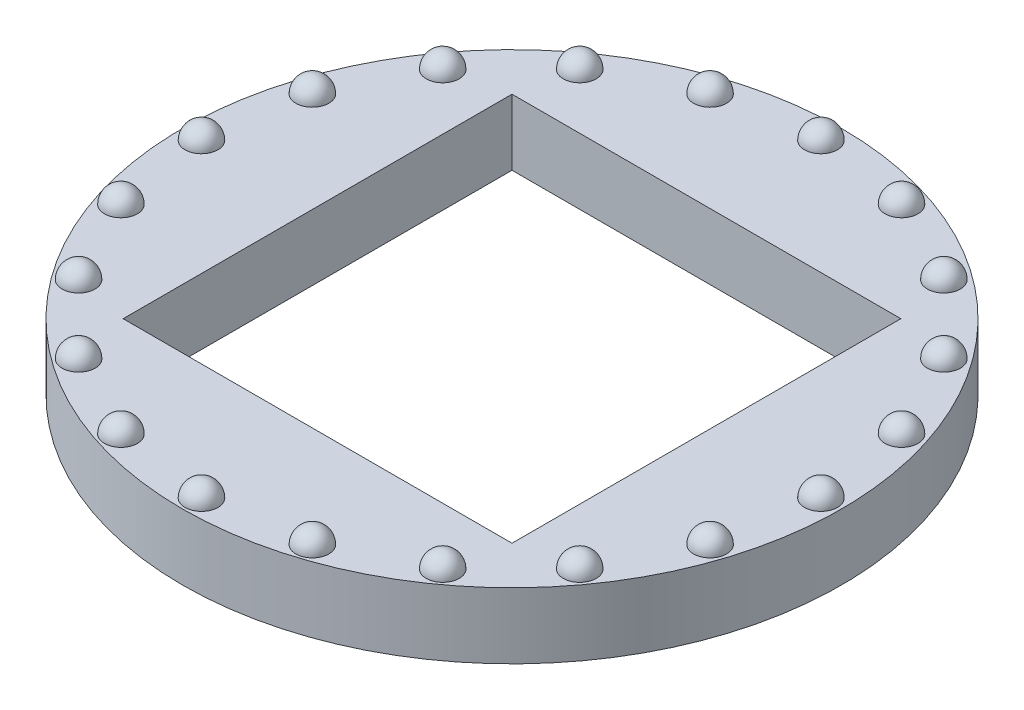
ISO-10303-21;
HEADER;
FILE_DESCRIPTION(('STEP AP214'),'2;1');
FILE_NAME('part.step','',(''),(''),'','','');
FILE_SCHEMA(('AUTOMOTIVE_DESIGN { 1 0 10303 214 1 1 1 1 }'));
ENDSEC;
DATA;
#1=APPLICATION_CONTEXT('core data for automotive mechanical design processes');
#2=APPLICATION_PROTOCOL_DEFINITION('international standard','automotive_design',2000,#1);
#3=PRODUCT_CONTEXT('',#1,'mechanical');
#4=PRODUCT('Part','Part','',(#3));
#5=PRODUCT_RELATED_PRODUCT_CATEGORY('part','',(#4));
#6=PRODUCT_DEFINITION_FORMATION('','',#4);
#7=PRODUCT_DEFINITION_CONTEXT('part definition',#1,'design');
#8=PRODUCT_DEFINITION('design','',#6,#7);
#9=PRODUCT_DEFINITION_SHAPE('','',#8);
#10=(LENGTH_UNIT() NAMED_UNIT(*) SI_UNIT(.MILLI.,.METRE.));
#11=(NAMED_UNIT(*) PLANE_ANGLE_UNIT() SI_UNIT($,.RADIAN.));
#12=(NAMED_UNIT(*) SI_UNIT($,.STERADIAN.) SOLID_ANGLE_UNIT());
#13=UNCERTAINTY_MEASURE_WITH_UNIT(LENGTH_MEASURE(1.E-05),#10,'distance_accuracy_value','');
#14=(GEOMETRIC_REPRESENTATION_CONTEXT(3) GLOBAL_UNCERTAINTY_ASSIGNED_CONTEXT((#13)) GLOBAL_UNIT_ASSIGNED_CONTEXT((#10,
#11,#12)) REPRESENTATION_CONTEXT('',''));
#15=CARTESIAN_POINT('',(0.,0.,0.));
#16=DIRECTION('',(0.,0.,1.));
#17=DIRECTION('',(1.,0.,0.));
#18=AXIS2_PLACEMENT_3D('',#15,#16,#17);
#19=CARTESIAN_POINT('',(0.,8.,0.));
#20=DIRECTION('',(0.,-1.,0.));
#21=DIRECTION('',(0.,0.,-1.));
#22=AXIS2_PLACEMENT_3D('',#19,#20,#21);
#23=CYLINDRICAL_SURFACE('',#22,40.);
#24=CARTESIAN_POINT('',(0.,8.,0.));
#25=DIRECTION('',(0.,1.,0.));
#26=DIRECTION('',(0.,0.,1.));
#27=AXIS2_PLACEMENT_3D('',#24,#25,#26);
#28=CIRCLE('',#27,40.);
#29=CARTESIAN_POINT('',(0.,8.,40.));
#30=VERTEX_POINT('',#29);
#31=EDGE_CURVE('E112',#30,#30,#28,.T.);
#32=ORIENTED_EDGE('',*,*,#31,.F.);
#33=EDGE_LOOP('',(#32));
#34=FACE_BOUND('',#33,.T.);
#35=CARTESIAN_POINT('',(0.,0.,0.));
#36=DIRECTION('',(0.,1.,0.));
#37=DIRECTION('',(0.,0.,1.));
#38=AXIS2_PLACEMENT_3D('',#35,#36,#37);
#39=CIRCLE('',#38,40.);
#40=CARTESIAN_POINT('',(0.,0.,40.));
#41=VERTEX_POINT('',#40);
#42=EDGE_CURVE('E111',#41,#41,#39,.T.);
#43=ORIENTED_EDGE('',*,*,#42,.T.);
#44=EDGE_LOOP('',(#43));
#45=FACE_BOUND('',#44,.T.);
#46=ADVANCED_FACE('F36',(#34,#45),#23,.T.);
#47=CARTESIAN_POINT('',(0.,8.,0.));
#48=DIRECTION('',(0.,1.,0.));
#49=DIRECTION('',(0.,0.,1.));
#50=AXIS2_PLACEMENT_3D('',#47,#48,#49);
#51=PLANE('',#50);
#52=DIRECTION('',(0.,0.,-1.));
#53=VECTOR('',#52,1.);
#54=CARTESIAN_POINT('',(23.6,8.,0.));
#55=LINE('',#54,#53);
#56=CARTESIAN_POINT('',(23.6,8.,23.6));
#57=VERTEX_POINT('',#56);
#58=CARTESIAN_POINT('',(23.6,8.,-23.6));
#59=VERTEX_POINT('',#58);
#60=EDGE_CURVE('E109',#57,#59,#55,.T.);
#61=ORIENTED_EDGE('',*,*,#60,.F.);
#62=DIRECTION('',(1.,0.,0.));
#63=VECTOR('',#62,1.);
#64=CARTESIAN_POINT('',(0.,8.,23.6));
#65=LINE('',#64,#63);
#66=CARTESIAN_POINT('',(-23.6,8.,23.6));
#67=VERTEX_POINT('',#66);
#68=EDGE_CURVE('E102',#67,#57,#65,.T.);
#69=ORIENTED_EDGE('',*,*,#68,.F.);
#70=DIRECTION('',(0.,0.,1.));
#71=VECTOR('',#70,1.);
#72=CARTESIAN_POINT('',(-23.6,8.,0.));
#73=LINE('',#72,#71);
#74=CARTESIAN_POINT('',(-23.6,8.,-23.6));
#75=VERTEX_POINT('',#74);
#76=EDGE_CURVE('E82',#75,#67,#73,.T.);
#77=ORIENTED_EDGE('',*,*,#76,.F.);
#78=DIRECTION('',(-1.,0.,0.));
#79=VECTOR('',#78,1.);
#80=CARTESIAN_POINT('',(0.,8.,-23.6));
#81=LINE('',#80,#79);
#82=EDGE_CURVE('E107',#59,#75,#81,.T.);
#83=ORIENTED_EDGE('',*,*,#82,.F.);
#84=EDGE_LOOP('',(#61,#69,#77,#83));
#85=FACE_BOUND('',#84,.T.);
#86=CARTESIAN_POINT('',(11.6171802396592,8.,-35.6600194095924));
#87=DIRECTION('',(0.,1.,0.));
#88=DIRECTION('',(0.,0.,1.));
#89=AXIS2_PLACEMENT_3D('',#86,#87,#88);
#90=CIRCLE('',#89,2.);
#91=CARTESIAN_POINT('',(11.6171802396592,8.,-33.6600194095924));
#92=VERTEX_POINT('',#91);
#93=EDGE_CURVE('E11',#92,#92,#90,.T.);
#94=ORIENTED_EDGE('',*,*,#93,.F.);
#95=EDGE_LOOP('',(#94));
#96=FACE_BOUND('',#95,.T.);
#97=CARTESIAN_POINT('',(22.0971899358069,8.,-30.320187758457));
#98=DIRECTION('',(0.,1.,0.));
#99=DIRECTION('',(0.,0.,1.));
#100=AXIS2_PLACEMENT_3D('',#97,#98,#99);
#101=CIRCLE('',#100,2.);
#102=CARTESIAN_POINT('',(22.0971899358069,8.,-28.320187758457));
#103=VERTEX_POINT('',#102);
#104=EDGE_CURVE('E43',#103,#103,#101,.T.);
#105=ORIENTED_EDGE('',*,*,#104,.F.);
#106=EDGE_LOOP('',(#105));
#107=FACE_BOUND('',#106,.T.);
#108=CARTESIAN_POINT('',(30.4141727208624,8.,-22.0032049734016));
#109=DIRECTION('',(0.,1.,0.));
#110=DIRECTION('',(0.,0.,1.));
#111=AXIS2_PLACEMENT_3D('',#108,#109,#110);
#112=CIRCLE('',#111,2.);
#113=CARTESIAN_POINT('',(30.4141727208624,8.,-20.0032049734016));
#114=VERTEX_POINT('',#113);
#115=EDGE_CURVE('E168',#114,#114,#112,.T.);
#116=ORIENTED_EDGE('',*,*,#115,.F.);
#117=EDGE_LOOP('',(#116));
#118=FACE_BOUND('',#117,.T.);
#119=CARTESIAN_POINT('',(35.7540043719981,8.,-11.5231952772541));
#120=DIRECTION('',(0.,1.,0.));
#121=DIRECTION('',(0.,0.,1.));
#122=AXIS2_PLACEMENT_3D('',#119,#120,#121);
#123=CIRCLE('',#122,2.);
#124=CARTESIAN_POINT('',(35.7540043719981,8.,-9.52319527725407));
#125=VERTEX_POINT('',#124);
#126=EDGE_CURVE('E165',#125,#125,#123,.T.);
#127=ORIENTED_EDGE('',*,*,#126,.F.);
#128=EDGE_LOOP('',(#127));
#129=FACE_BOUND('',#128,.T.);
#130=CARTESIAN_POINT('',(37.593984962406,8.,0.0939849624056159));
#131=DIRECTION('',(0.,1.,0.));
#132=DIRECTION('',(0.,0.,1.));
#133=AXIS2_PLACEMENT_3D('',#130,#131,#132);
#134=CIRCLE('',#133,2.);
#135=CARTESIAN_POINT('',(37.593984962406,8.,2.09398496240562));
#136=VERTEX_POINT('',#135);
#137=EDGE_CURVE('E162',#136,#136,#134,.T.);
#138=ORIENTED_EDGE('',*,*,#137,.F.);
#139=EDGE_LOOP('',(#138));
#140=FACE_BOUND('',#139,.T.);
#141=CARTESIAN_POINT('',(35.7540043719984,8.,11.7111652020653));
#142=DIRECTION('',(0.,1.,0.));
#143=DIRECTION('',(0.,0.,1.));
#144=AXIS2_PLACEMENT_3D('',#141,#142,#143);
#145=CIRCLE('',#144,2.);
#146=CARTESIAN_POINT('',(35.7540043719984,8.,13.7111652020653));
#147=VERTEX_POINT('',#146);
#148=EDGE_CURVE('E159',#147,#147,#145,.T.);
#149=ORIENTED_EDGE('',*,*,#148,.F.);
#150=EDGE_LOOP('',(#149));
#151=FACE_BOUND('',#150,.T.);
#152=CARTESIAN_POINT('',(30.4141727208629,8.,22.191174898213));
#153=DIRECTION('',(0.,1.,0.));
#154=DIRECTION('',(0.,0.,1.));
#155=AXIS2_PLACEMENT_3D('',#152,#153,#154);
#156=CIRCLE('',#155,2.);
#157=CARTESIAN_POINT('',(30.4141727208629,8.,24.191174898213));
#158=VERTEX_POINT('',#157);
#159=EDGE_CURVE('E156',#158,#158,#156,.T.);
#160=ORIENTED_EDGE('',*,*,#159,.F.);
#161=EDGE_LOOP('',(#160));
#162=FACE_BOUND('',#161,.T.);
#163=CARTESIAN_POINT('',(22.0971899358075,8.,30.5081576832685));
#164=DIRECTION('',(0.,1.,0.));
#165=DIRECTION('',(0.,0.,1.));
#166=AXIS2_PLACEMENT_3D('',#163,#164,#165);
#167=CIRCLE('',#166,2.);
#168=CARTESIAN_POINT('',(22.0971899358075,8.,32.5081576832685));
#169=VERTEX_POINT('',#168);
#170=EDGE_CURVE('E153',#169,#169,#167,.T.);
#171=ORIENTED_EDGE('',*,*,#170,.F.);
#172=EDGE_LOOP('',(#171));
#173=FACE_BOUND('',#172,.T.);
#174=CARTESIAN_POINT('',(11.61718023966,8.,35.8479893344042));
#175=DIRECTION('',(0.,1.,0.));
#176=DIRECTION('',(0.,0.,1.));
#177=AXIS2_PLACEMENT_3D('',#174,#175,#176);
#178=CIRCLE('',#177,2.);
#179=CARTESIAN_POINT('',(11.61718023966,8.,37.8479893344042));
#180=VERTEX_POINT('',#179);
#181=EDGE_CURVE('E150',#180,#180,#178,.T.);
#182=ORIENTED_EDGE('',*,*,#181,.F.);
#183=EDGE_LOOP('',(#182));
#184=FACE_BOUND('',#183,.T.);
#185=CARTESIAN_POINT('',(0.,8.,37.687969924812));
#186=DIRECTION('',(0.,1.,0.));
#187=DIRECTION('',(0.,0.,1.));
#188=AXIS2_PLACEMENT_3D('',#185,#186,#187);
#189=CIRCLE('',#188,2.);
#190=CARTESIAN_POINT('',(0.,8.,39.687969924812));
#191=VERTEX_POINT('',#190);
#192=EDGE_CURVE('E147',#191,#191,#189,.T.);
#193=ORIENTED_EDGE('',*,*,#192,.F.);
#194=EDGE_LOOP('',(#193));
#195=FACE_BOUND('',#194,.T.);
#196=CARTESIAN_POINT('',(-11.6171802396594,8.,35.8479893344043));
#197=DIRECTION('',(0.,1.,0.));
#198=DIRECTION('',(0.,0.,1.));
#199=AXIS2_PLACEMENT_3D('',#196,#197,#198);
#200=CIRCLE('',#199,2.);
#201=CARTESIAN_POINT('',(-11.6171802396594,8.,37.8479893344043));
#202=VERTEX_POINT('',#201);
#203=EDGE_CURVE('E144',#202,#202,#200,.T.);
#204=ORIENTED_EDGE('',*,*,#203,.F.);
#205=EDGE_LOOP('',(#204));
#206=FACE_BOUND('',#205,.T.);
#207=CARTESIAN_POINT('',(-22.0971899358071,8.,30.5081576832688));
#208=DIRECTION('',(0.,1.,0.));
#209=DIRECTION('',(0.,0.,1.));
#210=AXIS2_PLACEMENT_3D('',#207,#208,#209);
#211=CIRCLE('',#210,2.);
#212=CARTESIAN_POINT('',(-22.0971899358071,8.,32.5081576832688));
#213=VERTEX_POINT('',#212);
#214=EDGE_CURVE('E141',#213,#213,#211,.T.);
#215=ORIENTED_EDGE('',*,*,#214,.F.);
#216=EDGE_LOOP('',(#215));
#217=FACE_BOUND('',#216,.T.);
#218=CARTESIAN_POINT('',(-30.4141727208626,8.,22.1911748982134));
#219=DIRECTION('',(0.,1.,0.));
#220=DIRECTION('',(0.,0.,1.));
#221=AXIS2_PLACEMENT_3D('',#218,#219,#220);
#222=CIRCLE('',#221,2.);
#223=CARTESIAN_POINT('',(-30.4141727208626,8.,24.1911748982134));
#224=VERTEX_POINT('',#223);
#225=EDGE_CURVE('E138',#224,#224,#222,.T.);
#226=ORIENTED_EDGE('',*,*,#225,.F.);
#227=EDGE_LOOP('',(#226));
#228=FACE_BOUND('',#227,.T.);
#229=CARTESIAN_POINT('',(-35.7540043719982,8.,11.7111652020658));
#230=DIRECTION('',(0.,1.,0.));
#231=DIRECTION('',(0.,0.,1.));
#232=AXIS2_PLACEMENT_3D('',#229,#230,#231);
#233=CIRCLE('',#232,2.);
#234=CARTESIAN_POINT('',(-35.7540043719982,8.,13.7111652020658));
#235=VERTEX_POINT('',#234);
#236=EDGE_CURVE('E135',#235,#235,#233,.T.);
#237=ORIENTED_EDGE('',*,*,#236,.F.);
#238=EDGE_LOOP('',(#237));
#239=FACE_BOUND('',#238,.T.);
#240=CARTESIAN_POINT('',(-37.593984962406,8.,0.0939849624061409));
#241=DIRECTION('',(0.,1.,0.));
#242=DIRECTION('',(0.,0.,1.));
#243=AXIS2_PLACEMENT_3D('',#240,#241,#242);
#244=CIRCLE('',#243,2.);
#245=CARTESIAN_POINT('',(-37.593984962406,8.,2.09398496240614));
#246=VERTEX_POINT('',#245);
#247=EDGE_CURVE('E132',#246,#246,#244,.T.);
#248=ORIENTED_EDGE('',*,*,#247,.F.);
#249=EDGE_LOOP('',(#248));
#250=FACE_BOUND('',#249,.T.);
#251=CARTESIAN_POINT('',(-35.7540043719983,8.,-11.5231952772536));
#252=DIRECTION('',(0.,1.,0.));
#253=DIRECTION('',(0.,0.,1.));
#254=AXIS2_PLACEMENT_3D('',#251,#252,#253);
#255=CIRCLE('',#254,2.);
#256=CARTESIAN_POINT('',(-35.7540043719983,8.,-9.52319527725357));
#257=VERTEX_POINT('',#256);
#258=EDGE_CURVE('E129',#257,#257,#255,.T.);
#259=ORIENTED_EDGE('',*,*,#258,.F.);
#260=EDGE_LOOP('',(#259));
#261=FACE_BOUND('',#260,.T.);
#262=CARTESIAN_POINT('',(-30.4141727208627,8.,-22.0032049734012));
#263=DIRECTION('',(0.,1.,0.));
#264=DIRECTION('',(0.,0.,1.));
#265=AXIS2_PLACEMENT_3D('',#262,#263,#264);
#266=CIRCLE('',#265,2.);
#267=CARTESIAN_POINT('',(-30.4141727208627,8.,-20.0032049734012));
#268=VERTEX_POINT('',#267);
#269=EDGE_CURVE('E126',#268,#268,#266,.T.);
#270=ORIENTED_EDGE('',*,*,#269,.F.);
#271=EDGE_LOOP('',(#270));
#272=FACE_BOUND('',#271,.T.);
#273=CARTESIAN_POINT('',(-22.0971899358073,8.,-30.3201877584567));
#274=DIRECTION('',(0.,1.,0.));
#275=DIRECTION('',(0.,0.,1.));
#276=AXIS2_PLACEMENT_3D('',#273,#274,#275);
#277=CIRCLE('',#276,2.);
#278=CARTESIAN_POINT('',(-22.0971899358073,8.,-28.3201877584567));
#279=VERTEX_POINT('',#278);
#280=EDGE_CURVE('E123',#279,#279,#277,.T.);
#281=ORIENTED_EDGE('',*,*,#280,.F.);
#282=EDGE_LOOP('',(#281));
#283=FACE_BOUND('',#282,.T.);
#284=CARTESIAN_POINT('',(-11.6171802396597,8.,-35.6600194095922));
#285=DIRECTION('',(0.,1.,0.));
#286=DIRECTION('',(0.,0.,1.));
#287=AXIS2_PLACEMENT_3D('',#284,#285,#286);
#288=CIRCLE('',#287,2.);
#289=CARTESIAN_POINT('',(-11.6171802396597,8.,-33.6600194095922));
#290=VERTEX_POINT('',#289);
#291=EDGE_CURVE('E120',#290,#290,#288,.T.);
#292=ORIENTED_EDGE('',*,*,#291,.F.);
#293=EDGE_LOOP('',(#292));
#294=FACE_BOUND('',#293,.T.);
#295=CARTESIAN_POINT('',(0.,8.,-37.5));
#296=DIRECTION('',(0.,1.,0.));
#297=DIRECTION('',(0.,0.,1.));
#298=AXIS2_PLACEMENT_3D('',#295,#296,#297);
#299=CIRCLE('',#298,2.);
#300=CARTESIAN_POINT('',(0.,8.,-35.5));
#301=VERTEX_POINT('',#300);
#302=EDGE_CURVE('E115',#301,#301,#299,.T.);
#303=ORIENTED_EDGE('',*,*,#302,.F.);
#304=EDGE_LOOP('',(#303));
#305=FACE_BOUND('',#304,.T.);
#306=ORIENTED_EDGE('',*,*,#31,.T.);
#307=EDGE_LOOP('',(#306));
#308=FACE_BOUND('',#307,.T.);
#309=ADVANCED_FACE('F175',(#85,#96,#107,#118,#129,#140,#151,#162,#173,#184,#195,#206,#217,#228,
#239,#250,#261,#272,#283,#294,#305,#308),#51,.T.);
#310=CARTESIAN_POINT('',(0.,0.,0.));
#311=DIRECTION('',(0.,1.,0.));
#312=DIRECTION('',(0.,0.,1.));
#313=AXIS2_PLACEMENT_3D('',#310,#311,#312);
#314=PLANE('',#313);
#315=DIRECTION('',(-1.,0.,0.));
#316=VECTOR('',#315,1.);
#317=CARTESIAN_POINT('',(-23.6,0.,23.6));
#318=LINE('',#317,#316);
#319=CARTESIAN_POINT('',(23.6,0.,23.6));
#320=VERTEX_POINT('',#319);
#321=CARTESIAN_POINT('',(-23.6,0.,23.6));
#322=VERTEX_POINT('',#321);
#323=EDGE_CURVE('E88',#320,#322,#318,.T.);
#324=ORIENTED_EDGE('',*,*,#323,.F.);
#325=DIRECTION('',(0.,0.,1.));
#326=VECTOR('',#325,1.);
#327=CARTESIAN_POINT('',(23.6,0.,23.6));
#328=LINE('',#327,#326);
#329=CARTESIAN_POINT('',(23.6,0.,-23.6));
#330=VERTEX_POINT('',#329);
#331=EDGE_CURVE('E58',#330,#320,#328,.T.);
#332=ORIENTED_EDGE('',*,*,#331,.F.);
#333=DIRECTION('',(1.,0.,0.));
#334=VECTOR('',#333,1.);
#335=CARTESIAN_POINT('',(-23.6,0.,-23.6));
#336=LINE('',#335,#334);
#337=CARTESIAN_POINT('',(-23.6,0.,-23.6));
#338=VERTEX_POINT('',#337);
#339=EDGE_CURVE('E95',#338,#330,#336,.T.);
#340=ORIENTED_EDGE('',*,*,#339,.F.);
#341=DIRECTION('',(0.,0.,-1.));
#342=VECTOR('',#341,1.);
#343=CARTESIAN_POINT('',(-23.6,0.,23.6));
#344=LINE('',#343,#342);
#345=EDGE_CURVE('E79',#322,#338,#344,.T.);
#346=ORIENTED_EDGE('',*,*,#345,.F.);
#347=EDGE_LOOP('',(#324,#332,#340,#346));
#348=FACE_BOUND('',#347,.T.);
#349=ORIENTED_EDGE('',*,*,#42,.F.);
#350=EDGE_LOOP('',(#349));
#351=FACE_BOUND('',#350,.T.);
#352=ADVANCED_FACE('F92',(#348,#351),#314,.F.);
#353=CARTESIAN_POINT('',(0.,8.,-37.5));
#354=DIRECTION('',(0.,-1.,0.));
#355=DIRECTION('',(0.,0.,-1.));
#356=AXIS2_PLACEMENT_3D('',#353,#354,#355);
#357=SPHERICAL_SURFACE('',#356,2.);
#358=ORIENTED_EDGE('',*,*,#302,.T.);
#359=EDGE_LOOP('',(#358));
#360=FACE_BOUND('',#359,.T.);
#361=ADVANCED_FACE('F222',(#360),#357,.T.);
#362=CARTESIAN_POINT('',(-11.6171802396597,8.,-35.6600194095922));
#363=DIRECTION('',(0.,-1.,0.));
#364=DIRECTION('',(-0.309016994374948,0.,-0.951056516295154));
#365=AXIS2_PLACEMENT_3D('',#362,#363,#364);
#366=SPHERICAL_SURFACE('',#365,2.);
#367=ORIENTED_EDGE('',*,*,#291,.T.);
#368=EDGE_LOOP('',(#367));
#369=FACE_BOUND('',#368,.T.);
#370=ADVANCED_FACE('F226',(#369),#366,.T.);
#371=CARTESIAN_POINT('',(-22.0971899358073,8.,-30.3201877584567));
#372=DIRECTION('',(0.,-1.,0.));
#373=DIRECTION('',(-0.587785252292474,0.,-0.809016994374947));
#374=AXIS2_PLACEMENT_3D('',#371,#372,#373);
#375=SPHERICAL_SURFACE('',#374,2.);
#376=ORIENTED_EDGE('',*,*,#280,.T.);
#377=EDGE_LOOP('',(#376));
#378=FACE_BOUND('',#377,.T.);
#379=ADVANCED_FACE('F232',(#378),#375,.T.);
#380=CARTESIAN_POINT('',(-30.4141727208627,8.,-22.0032049734012));
#381=DIRECTION('',(0.,-1.,0.));
#382=DIRECTION('',(-0.809016994374949,0.,-0.587785252292471));
#383=AXIS2_PLACEMENT_3D('',#380,#381,#382);
#384=SPHERICAL_SURFACE('',#383,2.);
#385=ORIENTED_EDGE('',*,*,#269,.T.);
#386=EDGE_LOOP('',(#385));
#387=FACE_BOUND('',#386,.T.);
#388=ADVANCED_FACE('F236',(#387),#384,.T.);
#389=CARTESIAN_POINT('',(-35.7540043719983,8.,-11.5231952772536));
#390=DIRECTION('',(0.,-1.,0.));
#391=DIRECTION('',(-0.951056516295155,0.,-0.309016994374945));
#392=AXIS2_PLACEMENT_3D('',#389,#390,#391);
#393=SPHERICAL_SURFACE('',#392,2.);
#394=ORIENTED_EDGE('',*,*,#258,.T.);
#395=EDGE_LOOP('',(#394));
#396=FACE_BOUND('',#395,.T.);
#397=ADVANCED_FACE('F240',(#396),#393,.T.);
#398=CARTESIAN_POINT('',(-37.593984962406,8.,0.0939849624061409));
#399=DIRECTION('',(0.,-1.,0.));
#400=DIRECTION('',(-1.,0.,0.));
#401=AXIS2_PLACEMENT_3D('',#398,#399,#400);
#402=SPHERICAL_SURFACE('',#401,2.);
#403=ORIENTED_EDGE('',*,*,#247,.T.);
#404=EDGE_LOOP('',(#403));
#405=FACE_BOUND('',#404,.T.);
#406=ADVANCED_FACE('F244',(#405),#402,.T.);
#407=CARTESIAN_POINT('',(-35.7540043719982,8.,11.7111652020658));
#408=DIRECTION('',(0.,-1.,0.));
#409=DIRECTION('',(-0.951056516295152,0.,0.309016994374952));
#410=AXIS2_PLACEMENT_3D('',#407,#408,#409);
#411=SPHERICAL_SURFACE('',#410,2.);
#412=ORIENTED_EDGE('',*,*,#236,.T.);
#413=EDGE_LOOP('',(#412));
#414=FACE_BOUND('',#413,.T.);
#415=ADVANCED_FACE('F248',(#414),#411,.T.);
#416=CARTESIAN_POINT('',(-30.4141727208626,8.,22.1911748982134));
#417=DIRECTION('',(0.,-1.,0.));
#418=DIRECTION('',(-0.809016994374945,0.,0.587785252292477));
#419=AXIS2_PLACEMENT_3D('',#416,#417,#418);
#420=SPHERICAL_SURFACE('',#419,2.);
#421=ORIENTED_EDGE('',*,*,#225,.T.);
#422=EDGE_LOOP('',(#421));
#423=FACE_BOUND('',#422,.T.);
#424=ADVANCED_FACE('F252',(#423),#420,.T.);
#425=CARTESIAN_POINT('',(-22.0971899358071,8.,30.5081576832688));
#426=DIRECTION('',(0.,-1.,0.));
#427=DIRECTION('',(-0.587785252292469,0.,0.809016994374951));
#428=AXIS2_PLACEMENT_3D('',#425,#426,#427);
#429=SPHERICAL_SURFACE('',#428,2.);
#430=ORIENTED_EDGE('',*,*,#214,.T.);
#431=EDGE_LOOP('',(#430));
#432=FACE_BOUND('',#431,.T.);
#433=ADVANCED_FACE('F256',(#432),#429,.T.);
#434=CARTESIAN_POINT('',(-11.6171802396594,8.,35.8479893344043));
#435=DIRECTION('',(0.,-1.,0.));
#436=DIRECTION('',(-0.309016994374941,0.,0.951056516295156));
#437=AXIS2_PLACEMENT_3D('',#434,#435,#436);
#438=SPHERICAL_SURFACE('',#437,2.);
#439=ORIENTED_EDGE('',*,*,#203,.T.);
#440=EDGE_LOOP('',(#439));
#441=FACE_BOUND('',#440,.T.);
#442=ADVANCED_FACE('F260',(#441),#438,.T.);
#443=CARTESIAN_POINT('',(0.,8.,37.687969924812));
#444=DIRECTION('',(0.,-1.,0.));
#445=DIRECTION('',(0.,0.,1.));
#446=AXIS2_PLACEMENT_3D('',#443,#444,#445);
#447=SPHERICAL_SURFACE('',#446,2.);
#448=ORIENTED_EDGE('',*,*,#192,.T.);
#449=EDGE_LOOP('',(#448));
#450=FACE_BOUND('',#449,.T.);
#451=ADVANCED_FACE('F264',(#450),#447,.T.);
#452=CARTESIAN_POINT('',(11.61718023966,8.,35.8479893344042));
#453=DIRECTION('',(0.,-1.,0.));
#454=DIRECTION('',(0.309016994374955,0.,0.951056516295151));
#455=AXIS2_PLACEMENT_3D('',#452,#453,#454);
#456=SPHERICAL_SURFACE('',#455,2.);
#457=ORIENTED_EDGE('',*,*,#181,.T.);
#458=EDGE_LOOP('',(#457));
#459=FACE_BOUND('',#458,.T.);
#460=ADVANCED_FACE('F268',(#459),#456,.T.);
#461=CARTESIAN_POINT('',(22.0971899358075,8.,30.5081576832685));
#462=DIRECTION('',(0.,-1.,0.));
#463=DIRECTION('',(0.58778525229248,0.,0.809016994374942));
#464=AXIS2_PLACEMENT_3D('',#461,#462,#463);
#465=SPHERICAL_SURFACE('',#464,2.);
#466=ORIENTED_EDGE('',*,*,#170,.T.);
#467=EDGE_LOOP('',(#466));
#468=FACE_BOUND('',#467,.T.);
#469=ADVANCED_FACE('F272',(#468),#465,.T.);
#470=CARTESIAN_POINT('',(30.4141727208629,8.,22.191174898213));
#471=DIRECTION('',(0.,-1.,0.));
#472=DIRECTION('',(0.809016994374953,0.,0.587785252292465));
#473=AXIS2_PLACEMENT_3D('',#470,#471,#472);
#474=SPHERICAL_SURFACE('',#473,2.);
#475=ORIENTED_EDGE('',*,*,#159,.T.);
#476=EDGE_LOOP('',(#475));
#477=FACE_BOUND('',#476,.T.);
#478=ADVANCED_FACE('F276',(#477),#474,.T.);
#479=CARTESIAN_POINT('',(35.7540043719984,8.,11.7111652020653));
#480=DIRECTION('',(0.,-1.,0.));
#481=DIRECTION('',(0.951056516295157,0.,0.309016994374938));
#482=AXIS2_PLACEMENT_3D('',#479,#480,#481);
#483=SPHERICAL_SURFACE('',#482,2.);
#484=ORIENTED_EDGE('',*,*,#148,.T.);
#485=EDGE_LOOP('',(#484));
#486=FACE_BOUND('',#485,.T.);
#487=ADVANCED_FACE('F280',(#486),#483,.T.);
#488=CARTESIAN_POINT('',(37.593984962406,8.,0.0939849624056159));
#489=DIRECTION('',(0.,-1.,0.));
#490=DIRECTION('',(1.,0.,0.));
#491=AXIS2_PLACEMENT_3D('',#488,#489,#490);
#492=SPHERICAL_SURFACE('',#491,2.);
#493=ORIENTED_EDGE('',*,*,#137,.T.);
#494=EDGE_LOOP('',(#493));
#495=FACE_BOUND('',#494,.T.);
#496=ADVANCED_FACE('F284',(#495),#492,.T.);
#497=CARTESIAN_POINT('',(35.7540043719981,8.,-11.5231952772541));
#498=DIRECTION('',(0.,-1.,0.));
#499=DIRECTION('',(0.95105651629515,0.,-0.309016994374958));
#500=AXIS2_PLACEMENT_3D('',#497,#498,#499);
#501=SPHERICAL_SURFACE('',#500,2.);
#502=ORIENTED_EDGE('',*,*,#126,.T.);
#503=EDGE_LOOP('',(#502));
#504=FACE_BOUND('',#503,.T.);
#505=ADVANCED_FACE('F288',(#504),#501,.T.);
#506=CARTESIAN_POINT('',(30.4141727208624,8.,-22.0032049734016));
#507=DIRECTION('',(0.,-1.,0.));
#508=DIRECTION('',(0.80901699437494,0.,-0.587785252292483));
#509=AXIS2_PLACEMENT_3D('',#506,#507,#508);
#510=SPHERICAL_SURFACE('',#509,2.);
#511=ORIENTED_EDGE('',*,*,#115,.T.);
#512=EDGE_LOOP('',(#511));
#513=FACE_BOUND('',#512,.T.);
#514=ADVANCED_FACE('F292',(#513),#510,.T.);
#515=CARTESIAN_POINT('',(22.0971899358069,8.,-30.320187758457));
#516=DIRECTION('',(0.,-1.,0.));
#517=DIRECTION('',(0.587785252292462,0.,-0.809016994374955));
#518=AXIS2_PLACEMENT_3D('',#515,#516,#517);
#519=SPHERICAL_SURFACE('',#518,2.);
#520=ORIENTED_EDGE('',*,*,#104,.T.);
#521=EDGE_LOOP('',(#520));
#522=FACE_BOUND('',#521,.T.);
#523=ADVANCED_FACE('F173',(#522),#519,.T.);
#524=CARTESIAN_POINT('',(11.6171802396592,8.,-35.6600194095924));
#525=DIRECTION('',(0.,-1.,0.));
#526=DIRECTION('',(0.309016994374935,0.,-0.951056516295158));
#527=AXIS2_PLACEMENT_3D('',#524,#525,#526);
#528=SPHERICAL_SURFACE('',#527,2.);
#529=ORIENTED_EDGE('',*,*,#93,.T.);
#530=EDGE_LOOP('',(#529));
#531=FACE_BOUND('',#530,.T.);
#532=ADVANCED_FACE('F299',(#531),#528,.T.);
#533=CARTESIAN_POINT('',(23.6,10.,23.6));
#534=DIRECTION('',(1.,0.,0.));
#535=DIRECTION('',(0.,0.,-1.));
#536=AXIS2_PLACEMENT_3D('',#533,#534,#535);
#537=PLANE('',#536);
#538=ORIENTED_EDGE('',*,*,#60,.T.);
#539=DIRECTION('',(0.,-1.,0.));
#540=VECTOR('',#539,1.);
#541=CARTESIAN_POINT('',(23.6,10.,-23.6));
#542=LINE('',#541,#540);
#543=EDGE_CURVE('E100',#59,#330,#542,.T.);
#544=ORIENTED_EDGE('',*,*,#543,.T.);
#545=ORIENTED_EDGE('',*,*,#331,.T.);
#546=DIRECTION('',(0.,-1.,0.));
#547=VECTOR('',#546,1.);
#548=CARTESIAN_POINT('',(23.6,10.,23.6));
#549=LINE('',#548,#547);
#550=EDGE_CURVE('E85',#57,#320,#549,.T.);
#551=ORIENTED_EDGE('',*,*,#550,.F.);
#552=EDGE_LOOP('',(#538,#544,#545,#551));
#553=FACE_BOUND('',#552,.T.);
#554=ADVANCED_FACE('F302',(#553),#537,.F.);
#555=CARTESIAN_POINT('',(-23.6,10.,-23.6));
#556=DIRECTION('',(0.,0.,-1.));
#557=DIRECTION('',(-1.,0.,0.));
#558=AXIS2_PLACEMENT_3D('',#555,#556,#557);
#559=PLANE('',#558);
#560=ORIENTED_EDGE('',*,*,#82,.T.);
#561=DIRECTION('',(0.,-1.,0.));
#562=VECTOR('',#561,1.);
#563=CARTESIAN_POINT('',(-23.6,10.,-23.6));
#564=LINE('',#563,#562);
#565=EDGE_CURVE('E84',#75,#338,#564,.T.);
#566=ORIENTED_EDGE('',*,*,#565,.T.);
#567=ORIENTED_EDGE('',*,*,#339,.T.);
#568=ORIENTED_EDGE('',*,*,#543,.F.);
#569=EDGE_LOOP('',(#560,#566,#567,#568));
#570=FACE_BOUND('',#569,.T.);
#571=ADVANCED_FACE('F306',(#570),#559,.F.);
#572=CARTESIAN_POINT('',(-23.6,10.,23.6));
#573=DIRECTION('',(-1.,0.,0.));
#574=DIRECTION('',(0.,0.,1.));
#575=AXIS2_PLACEMENT_3D('',#572,#573,#574);
#576=PLANE('',#575);
#577=ORIENTED_EDGE('',*,*,#76,.T.);
#578=DIRECTION('',(0.,-1.,0.));
#579=VECTOR('',#578,1.);
#580=CARTESIAN_POINT('',(-23.6,10.,23.6));
#581=LINE('',#580,#579);
#582=EDGE_CURVE('E50',#67,#322,#581,.T.);
#583=ORIENTED_EDGE('',*,*,#582,.T.);
#584=ORIENTED_EDGE('',*,*,#345,.T.);
#585=ORIENTED_EDGE('',*,*,#565,.F.);
#586=EDGE_LOOP('',(#577,#583,#584,#585));
#587=FACE_BOUND('',#586,.T.);
#588=ADVANCED_FACE('F76',(#587),#576,.F.);
#589=CARTESIAN_POINT('',(-23.6,10.,23.6));
#590=DIRECTION('',(0.,0.,1.));
#591=DIRECTION('',(1.,0.,0.));
#592=AXIS2_PLACEMENT_3D('',#589,#590,#591);
#593=PLANE('',#592);
#594=ORIENTED_EDGE('',*,*,#68,.T.);
#595=ORIENTED_EDGE('',*,*,#550,.T.);
#596=ORIENTED_EDGE('',*,*,#323,.T.);
#597=ORIENTED_EDGE('',*,*,#582,.F.);
#598=EDGE_LOOP('',(#594,#595,#596,#597));
#599=FACE_BOUND('',#598,.T.);
#600=ADVANCED_FACE('F89',(#599),#593,.F.);
#601=CLOSED_SHELL('',(#46,#309,#352,#361,#370,#379,#388,#397,#406,#415,#424,#433,#442,#451,#460,
#469,#478,#487,#496,#505,#514,#523,#532,#554,#571,#588,#600));
#602=MANIFOLD_SOLID_BREP('B2',#601);
#603=ADVANCED_BREP_SHAPE_REPRESENTATION('',(#18,#602),#14);
#604=SHAPE_DEFINITION_REPRESENTATION(#9,#603);
ENDSEC;
END-ISO-10303-21;
